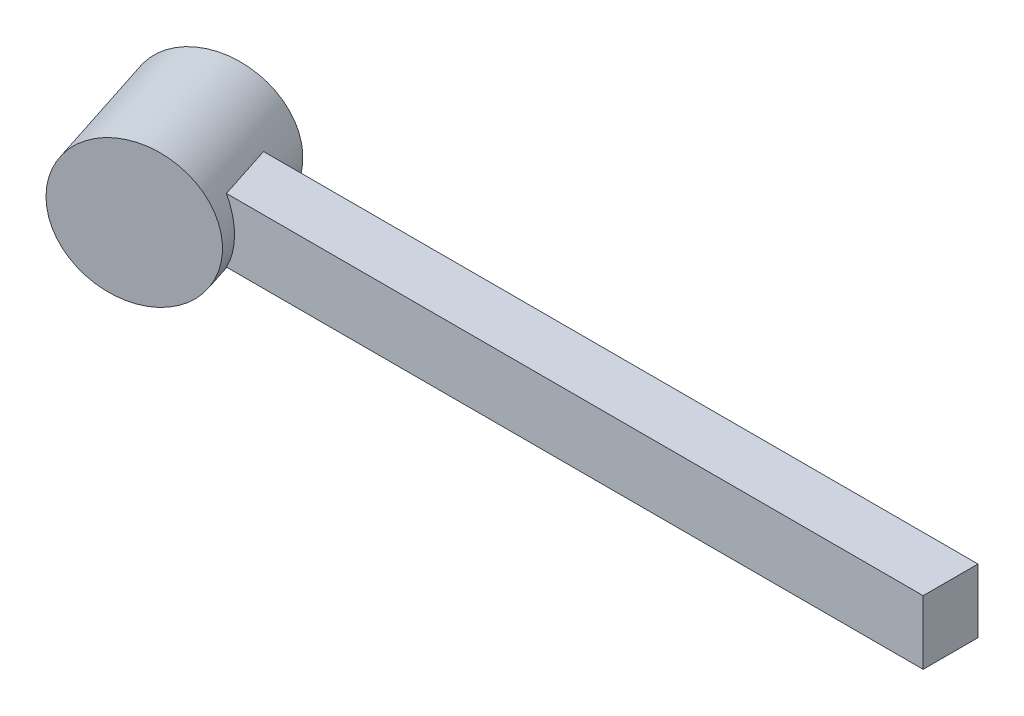
ISO-10303-21;
HEADER;
FILE_DESCRIPTION(('STEP AP214'),'2;1');
FILE_NAME('part.step','',(''),(''),'','','');
FILE_SCHEMA(('AUTOMOTIVE_DESIGN { 1 0 10303 214 1 1 1 1 }'));
ENDSEC;
DATA;
#1=APPLICATION_CONTEXT('core data for automotive mechanical design processes');
#2=APPLICATION_PROTOCOL_DEFINITION('international standard','automotive_design',2000,#1);
#3=PRODUCT_CONTEXT('',#1,'mechanical');
#4=PRODUCT('Part','Part','',(#3));
#5=PRODUCT_RELATED_PRODUCT_CATEGORY('part','',(#4));
#6=PRODUCT_DEFINITION_FORMATION('','',#4);
#7=PRODUCT_DEFINITION_CONTEXT('part definition',#1,'design');
#8=PRODUCT_DEFINITION('design','',#6,#7);
#9=PRODUCT_DEFINITION_SHAPE('','',#8);
#10=(LENGTH_UNIT() NAMED_UNIT(*) SI_UNIT(.MILLI.,.METRE.));
#11=(NAMED_UNIT(*) PLANE_ANGLE_UNIT() SI_UNIT($,.RADIAN.));
#12=(NAMED_UNIT(*) SI_UNIT($,.STERADIAN.) SOLID_ANGLE_UNIT());
#13=UNCERTAINTY_MEASURE_WITH_UNIT(LENGTH_MEASURE(1.E-05),#10,'distance_accuracy_value','');
#14=(GEOMETRIC_REPRESENTATION_CONTEXT(3) GLOBAL_UNCERTAINTY_ASSIGNED_CONTEXT((#13)) GLOBAL_UNIT_ASSIGNED_CONTEXT((#10,
#11,#12)) REPRESENTATION_CONTEXT('',''));
#15=CARTESIAN_POINT('',(0.,0.,0.));
#16=DIRECTION('',(0.,0.,1.));
#17=DIRECTION('',(1.,0.,0.));
#18=AXIS2_PLACEMENT_3D('',#15,#16,#17);
#19=CARTESIAN_POINT('',(-6.79687499999999,-1.,-1.71875));
#20=DIRECTION('',(0.,0.,-1.));
#21=DIRECTION('',(-1.,0.,0.));
#22=AXIS2_PLACEMENT_3D('',#19,#20,#21);
#23=PLANE('',#22);
#24=CARTESIAN_POINT('',(-6.24192452078469,0.,-1.71875));
#25=DIRECTION('',(0.,0.,-1.));
#26=DIRECTION('',(-1.,0.,0.));
#27=AXIS2_PLACEMENT_3D('',#24,#25,#26);
#28=ELLIPSE('',#27,2.30823186735213,2.19588799146443);
#29=CARTESIAN_POINT('',(-4.18693185478119,1.,-1.71875));
#30=VERTEX_POINT('',#29);
#31=CARTESIAN_POINT('',(-4.18693185478119,-1.,-1.71875));
#32=VERTEX_POINT('',#31);
#33=EDGE_CURVE('E85',#30,#32,#28,.T.);
#34=ORIENTED_EDGE('',*,*,#33,.F.);
#35=DIRECTION('',(-1.,0.,0.));
#36=VECTOR('',#35,1.);
#37=CARTESIAN_POINT('',(-6.79687499999999,1.,-1.71875));
#38=LINE('',#37,#36);
#39=CARTESIAN_POINT('',(18.203125,1.,-1.71875));
#40=VERTEX_POINT('',#39);
#41=EDGE_CURVE('E76',#40,#30,#38,.T.);
#42=ORIENTED_EDGE('',*,*,#41,.F.);
#43=DIRECTION('',(0.,1.,0.));
#44=VECTOR('',#43,1.);
#45=CARTESIAN_POINT('',(18.203125,-1.,-1.71875));
#46=LINE('',#45,#44);
#47=CARTESIAN_POINT('',(18.203125,-1.,-1.71875));
#48=VERTEX_POINT('',#47);
#49=EDGE_CURVE('E41',#48,#40,#46,.T.);
#50=ORIENTED_EDGE('',*,*,#49,.F.);
#51=DIRECTION('',(-1.,0.,0.));
#52=VECTOR('',#51,1.);
#53=CARTESIAN_POINT('',(-6.79687499999999,-1.,-1.71875));
#54=LINE('',#53,#52);
#55=EDGE_CURVE('E86',#48,#32,#54,.T.);
#56=ORIENTED_EDGE('',*,*,#55,.T.);
#57=EDGE_LOOP('',(#34,#42,#50,#56));
#58=FACE_BOUND('',#57,.T.);
#59=ADVANCED_FACE('F33',(#58),#23,.T.);
#60=CARTESIAN_POINT('',(18.203125,-1.,-1.71875));
#61=DIRECTION('',(1.,0.,0.));
#62=DIRECTION('',(0.,0.,-1.));
#63=AXIS2_PLACEMENT_3D('',#60,#61,#62);
#64=PLANE('',#63);
#65=ORIENTED_EDGE('',*,*,#49,.T.);
#66=DIRECTION('',(0.,0.,-1.));
#67=VECTOR('',#66,1.);
#68=CARTESIAN_POINT('',(18.203125,1.,-1.71875));
#69=LINE('',#68,#67);
#70=CARTESIAN_POINT('',(18.203125,1.,0.));
#71=VERTEX_POINT('',#70);
#72=EDGE_CURVE('E80',#71,#40,#69,.T.);
#73=ORIENTED_EDGE('',*,*,#72,.F.);
#74=DIRECTION('',(0.,1.,0.));
#75=VECTOR('',#74,1.);
#76=CARTESIAN_POINT('',(18.203125,-1.,0.));
#77=LINE('',#76,#75);
#78=CARTESIAN_POINT('',(18.203125,-1.,0.));
#79=VERTEX_POINT('',#78);
#80=EDGE_CURVE('E106',#79,#71,#77,.T.);
#81=ORIENTED_EDGE('',*,*,#80,.F.);
#82=DIRECTION('',(0.,0.,-1.));
#83=VECTOR('',#82,1.);
#84=CARTESIAN_POINT('',(18.203125,-1.,-1.71875));
#85=LINE('',#84,#83);
#86=EDGE_CURVE('E102',#79,#48,#85,.T.);
#87=ORIENTED_EDGE('',*,*,#86,.T.);
#88=EDGE_LOOP('',(#65,#73,#81,#87));
#89=FACE_BOUND('',#88,.T.);
#90=ADVANCED_FACE('F111',(#89),#64,.T.);
#91=CARTESIAN_POINT('',(-6.79687499999999,-1.,0.));
#92=DIRECTION('',(0.,0.,1.));
#93=DIRECTION('',(1.,0.,0.));
#94=AXIS2_PLACEMENT_3D('',#91,#92,#93);
#95=PLANE('',#94);
#96=CARTESIAN_POINT('',(-5.6851463517706,0.,0.));
#97=DIRECTION('',(0.,0.,1.));
#98=DIRECTION('',(-1.,0.,0.));
#99=AXIS2_PLACEMENT_3D('',#96,#97,#98);
#100=ELLIPSE('',#99,2.30823186735213,2.19588799146443);
#101=CARTESIAN_POINT('',(-3.63015368576711,-1.,0.));
#102=VERTEX_POINT('',#101);
#103=CARTESIAN_POINT('',(-3.63015368576711,1.,0.));
#104=VERTEX_POINT('',#103);
#105=EDGE_CURVE('E48',#102,#104,#100,.T.);
#106=ORIENTED_EDGE('',*,*,#105,.F.);
#107=DIRECTION('',(1.,0.,0.));
#108=VECTOR('',#107,1.);
#109=CARTESIAN_POINT('',(-6.79687499999999,-1.,0.));
#110=LINE('',#109,#108);
#111=EDGE_CURVE('E82',#102,#79,#110,.T.);
#112=ORIENTED_EDGE('',*,*,#111,.T.);
#113=ORIENTED_EDGE('',*,*,#80,.T.);
#114=DIRECTION('',(1.,0.,0.));
#115=VECTOR('',#114,1.);
#116=CARTESIAN_POINT('',(-6.79687499999999,1.,0.));
#117=LINE('',#116,#115);
#118=EDGE_CURVE('E98',#104,#71,#117,.T.);
#119=ORIENTED_EDGE('',*,*,#118,.F.);
#120=EDGE_LOOP('',(#106,#112,#113,#119));
#121=FACE_BOUND('',#120,.T.);
#122=ADVANCED_FACE('F35',(#121),#95,.T.);
#123=CARTESIAN_POINT('',(0.,-1.,0.));
#124=DIRECTION('',(0.,1.,0.));
#125=DIRECTION('',(0.,0.,1.));
#126=AXIS2_PLACEMENT_3D('',#123,#124,#125);
#127=PLANE('',#126);
#128=ORIENTED_EDGE('',*,*,#111,.F.);
#129=DIRECTION('',(-0.308177010852454,0.,-0.951329033501053));
#130=VECTOR('',#129,1.);
#131=CARTESIAN_POINT('',(-4.75605005273686,-1.,-3.47559313281969));
#132=LINE('',#131,#130);
#133=EDGE_CURVE('E55',#102,#32,#132,.T.);
#134=ORIENTED_EDGE('',*,*,#133,.T.);
#135=ORIENTED_EDGE('',*,*,#55,.F.);
#136=ORIENTED_EDGE('',*,*,#86,.F.);
#137=EDGE_LOOP('',(#128,#134,#135,#136));
#138=FACE_BOUND('',#137,.T.);
#139=ADVANCED_FACE('F112',(#138),#127,.F.);
#140=CARTESIAN_POINT('',(0.,1.,0.));
#141=DIRECTION('',(0.,1.,0.));
#142=DIRECTION('',(0.,0.,1.));
#143=AXIS2_PLACEMENT_3D('',#140,#141,#142);
#144=PLANE('',#143);
#145=DIRECTION('',(-0.308177010852454,0.,-0.951329033501053));
#146=VECTOR('',#145,1.);
#147=CARTESIAN_POINT('',(-4.75605005273686,1.,-3.47559313281969));
#148=LINE('',#147,#146);
#149=EDGE_CURVE('E11',#104,#30,#148,.T.);
#150=ORIENTED_EDGE('',*,*,#149,.F.);
#151=ORIENTED_EDGE('',*,*,#118,.T.);
#152=ORIENTED_EDGE('',*,*,#72,.T.);
#153=ORIENTED_EDGE('',*,*,#41,.T.);
#154=EDGE_LOOP('',(#150,#151,#152,#153));
#155=FACE_BOUND('',#154,.T.);
#156=ADVANCED_FACE('F78',(#155),#144,.T.);
#157=CARTESIAN_POINT('',(-6.61587375638563,0.,-2.8731150316377));
#158=DIRECTION('',(-0.308177010852454,0.,-0.951329033501053));
#159=DIRECTION('',(-0.951329033501053,0.,0.308177010852454));
#160=AXIS2_PLACEMENT_3D('',#157,#158,#159);
#161=CYLINDRICAL_SURFACE('',#160,2.19588799146443);
#162=CARTESIAN_POINT('',(-6.49264347970291,0.,-2.49270852535625));
#163=DIRECTION('',(-0.308177010852454,0.,-0.951329033501053));
#164=DIRECTION('',(-0.951329033501053,0.,0.308177010852454));
#165=AXIS2_PLACEMENT_3D('',#162,#163,#164);
#166=CIRCLE('',#165,2.19588799146443);
#167=CARTESIAN_POINT('',(-8.58165548029933,0.,-1.81598632797994));
#168=VERTEX_POINT('',#167);
#169=EDGE_CURVE('E90',#168,#168,#166,.T.);
#170=ORIENTED_EDGE('',*,*,#169,.F.);
#171=EDGE_LOOP('',(#170));
#172=FACE_BOUND('',#171,.T.);
#173=CARTESIAN_POINT('',(-5.28566557905836,0.,1.23317977663344));
#174=DIRECTION('',(-0.308177010852454,0.,-0.951329033501053));
#175=DIRECTION('',(-0.951329033501053,0.,0.308177010852454));
#176=AXIS2_PLACEMENT_3D('',#173,#174,#175);
#177=CIRCLE('',#176,2.19588799146443);
#178=CARTESIAN_POINT('',(-7.37467757965479,0.,1.90990197400974));
#179=VERTEX_POINT('',#178);
#180=EDGE_CURVE('E93',#179,#179,#177,.T.);
#181=ORIENTED_EDGE('',*,*,#180,.T.);
#182=EDGE_LOOP('',(#181));
#183=FACE_BOUND('',#182,.T.);
#184=ORIENTED_EDGE('',*,*,#133,.F.);
#185=ORIENTED_EDGE('',*,*,#105,.T.);
#186=ORIENTED_EDGE('',*,*,#149,.T.);
#187=ORIENTED_EDGE('',*,*,#33,.T.);
#188=EDGE_LOOP('',(#184,#185,#186,#187));
#189=FACE_BOUND('',#188,.T.);
#190=ADVANCED_FACE('F89',(#172,#183,#189),#161,.T.);
#191=CARTESIAN_POINT('',(-6.49264347970291,0.,-2.49270852535625));
#192=DIRECTION('',(-0.308177010852454,0.,-0.951329033501053));
#193=DIRECTION('',(-0.951329033501053,0.,0.308177010852454));
#194=AXIS2_PLACEMENT_3D('',#191,#192,#193);
#195=PLANE('',#194);
#196=ORIENTED_EDGE('',*,*,#169,.T.);
#197=EDGE_LOOP('',(#196));
#198=FACE_BOUND('',#197,.T.);
#199=ADVANCED_FACE('F152',(#198),#195,.T.);
#200=CARTESIAN_POINT('',(-7.37467757965479,0.,1.90990197400974));
#201=DIRECTION('',(0.308177010852454,0.,0.951329033501053));
#202=DIRECTION('',(0.951329033501053,0.,-0.308177010852454));
#203=AXIS2_PLACEMENT_3D('',#200,#201,#202);
#204=PLANE('',#203);
#205=ORIENTED_EDGE('',*,*,#180,.F.);
#206=EDGE_LOOP('',(#205));
#207=FACE_BOUND('',#206,.T.);
#208=ADVANCED_FACE('F162',(#207),#204,.T.);
#209=CLOSED_SHELL('',(#59,#90,#122,#139,#156,#190,#199,#208));
#210=MANIFOLD_SOLID_BREP('B2',#209);
#211=ADVANCED_BREP_SHAPE_REPRESENTATION('',(#18,#210),#14);
#212=SHAPE_DEFINITION_REPRESENTATION(#9,#211);
ENDSEC;
END-ISO-10303-21;
